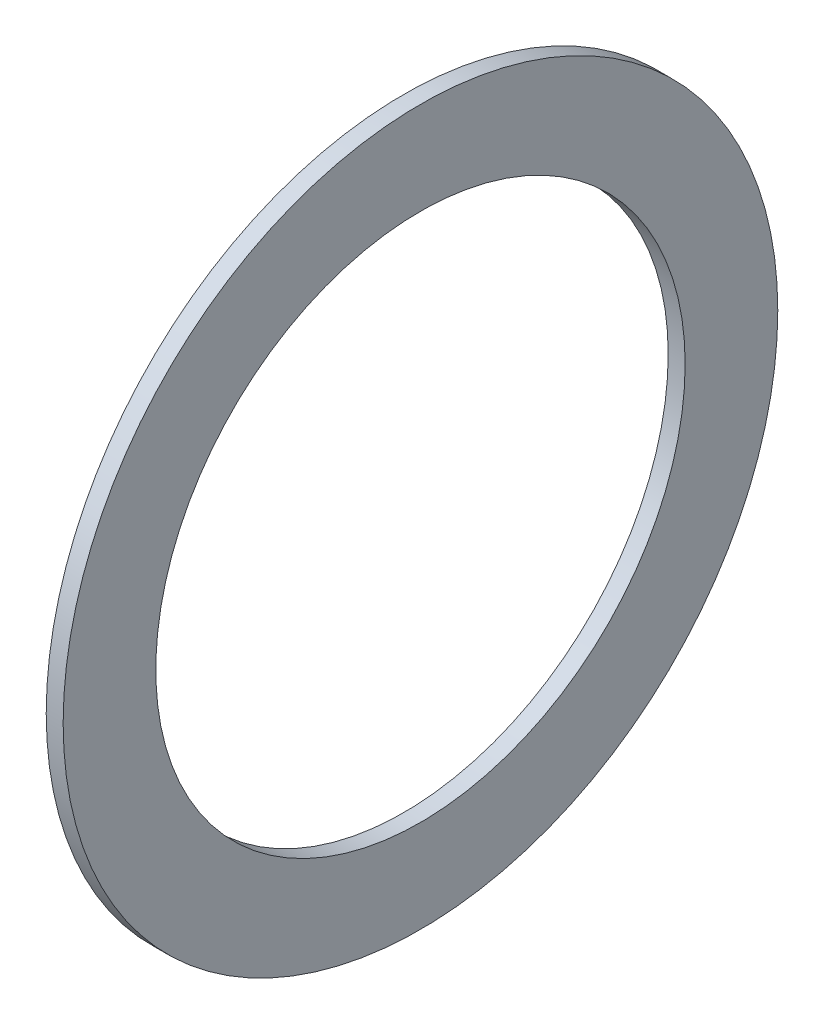
ISO-10303-21;
HEADER;
FILE_DESCRIPTION(('STEP AP214'),'2;1');
FILE_NAME('part.step','',(''),(''),'','','');
FILE_SCHEMA(('AUTOMOTIVE_DESIGN { 1 0 10303 214 1 1 1 1 }'));
ENDSEC;
DATA;
#1=APPLICATION_CONTEXT('core data for automotive mechanical design processes');
#2=APPLICATION_PROTOCOL_DEFINITION('international standard','automotive_design',2000,#1);
#3=PRODUCT_CONTEXT('',#1,'mechanical');
#4=PRODUCT('Part','Part','',(#3));
#5=PRODUCT_RELATED_PRODUCT_CATEGORY('part','',(#4));
#6=PRODUCT_DEFINITION_FORMATION('','',#4);
#7=PRODUCT_DEFINITION_CONTEXT('part definition',#1,'design');
#8=PRODUCT_DEFINITION('design','',#6,#7);
#9=PRODUCT_DEFINITION_SHAPE('','',#8);
#10=(LENGTH_UNIT() NAMED_UNIT(*) SI_UNIT(.MILLI.,.METRE.));
#11=(NAMED_UNIT(*) PLANE_ANGLE_UNIT() SI_UNIT($,.RADIAN.));
#12=(NAMED_UNIT(*) SI_UNIT($,.STERADIAN.) SOLID_ANGLE_UNIT());
#13=UNCERTAINTY_MEASURE_WITH_UNIT(LENGTH_MEASURE(1.E-05),#10,'distance_accuracy_value','');
#14=(GEOMETRIC_REPRESENTATION_CONTEXT(3) GLOBAL_UNCERTAINTY_ASSIGNED_CONTEXT((#13)) GLOBAL_UNIT_ASSIGNED_CONTEXT((#10,
#11,#12)) REPRESENTATION_CONTEXT('',''));
#15=CARTESIAN_POINT('',(0.,0.,0.));
#16=DIRECTION('',(0.,0.,1.));
#17=DIRECTION('',(1.,0.,0.));
#18=AXIS2_PLACEMENT_3D('',#15,#16,#17);
#19=CARTESIAN_POINT('',(1.6,-68.2479295829236,67.5));
#20=DIRECTION('',(1.,0.,0.));
#21=DIRECTION('',(0.,0.,-1.));
#22=AXIS2_PLACEMENT_3D('',#19,#20,#21);
#23=PLANE('',#22);
#24=CARTESIAN_POINT('',(1.6,0.,0.));
#25=DIRECTION('',(1.,0.,0.));
#26=DIRECTION('',(0.,-1.16865058535714E-09,1.));
#27=AXIS2_PLACEMENT_3D('',#24,#25,#26);
#28=CIRCLE('',#27,67.5);
#29=CARTESIAN_POINT('',(1.6,-7.88839145116071E-08,67.5));
#30=VERTEX_POINT('',#29);
#31=EDGE_CURVE('E30',#30,#30,#28,.T.);
#32=ORIENTED_EDGE('',*,*,#31,.T.);
#33=EDGE_LOOP('',(#32));
#34=FACE_BOUND('',#33,.T.);
#35=CARTESIAN_POINT('',(1.6,0.,0.));
#36=DIRECTION('',(-1.,0.,0.));
#37=DIRECTION('',(0.,-1.16851708753529E-09,-1.));
#38=AXIS2_PLACEMENT_3D('',#35,#36,#37);
#39=CIRCLE('',#38,50.);
#40=CARTESIAN_POINT('',(1.6,-5.84258543767646E-08,-50.));
#41=VERTEX_POINT('',#40);
#42=EDGE_CURVE('E26',#41,#41,#39,.F.);
#43=ORIENTED_EDGE('',*,*,#42,.F.);
#44=EDGE_LOOP('',(#43));
#45=FACE_BOUND('',#44,.T.);
#46=ADVANCED_FACE('F15',(#34,#45),#23,.T.);
#47=CARTESIAN_POINT('',(-1.6,-68.2479295829236,67.5));
#48=DIRECTION('',(-1.,0.,0.));
#49=DIRECTION('',(0.,1.,0.));
#50=AXIS2_PLACEMENT_3D('',#47,#48,#49);
#51=PLANE('',#50);
#52=CARTESIAN_POINT('',(-1.6,0.,0.));
#53=DIRECTION('',(-1.,0.,0.));
#54=DIRECTION('',(0.,-1.16865121695069E-09,-1.));
#55=AXIS2_PLACEMENT_3D('',#52,#53,#54);
#56=CIRCLE('',#55,67.5);
#57=CARTESIAN_POINT('',(-1.6,-7.88839571441713E-08,-67.5));
#58=VERTEX_POINT('',#57);
#59=EDGE_CURVE('E22',#58,#58,#56,.F.);
#60=ORIENTED_EDGE('',*,*,#59,.F.);
#61=EDGE_LOOP('',(#60));
#62=FACE_BOUND('',#61,.T.);
#63=CARTESIAN_POINT('',(-1.6,0.,0.));
#64=DIRECTION('',(1.,0.,0.));
#65=DIRECTION('',(0.,-1.16851708753529E-09,1.));
#66=AXIS2_PLACEMENT_3D('',#63,#64,#65);
#67=CIRCLE('',#66,50.);
#68=CARTESIAN_POINT('',(-1.6,-5.84258543767646E-08,50.));
#69=VERTEX_POINT('',#68);
#70=EDGE_CURVE('E10',#69,#69,#67,.T.);
#71=ORIENTED_EDGE('',*,*,#70,.T.);
#72=EDGE_LOOP('',(#71));
#73=FACE_BOUND('',#72,.T.);
#74=ADVANCED_FACE('F44',(#62,#73),#51,.T.);
#75=CARTESIAN_POINT('',(1.6,0.,0.));
#76=DIRECTION('',(-1.,0.,0.));
#77=DIRECTION('',(0.,0.,-1.));
#78=AXIS2_PLACEMENT_3D('',#75,#76,#77);
#79=CYLINDRICAL_SURFACE('',#78,50.);
#80=ORIENTED_EDGE('',*,*,#42,.T.);
#81=EDGE_LOOP('',(#80));
#82=FACE_BOUND('',#81,.T.);
#83=ORIENTED_EDGE('',*,*,#70,.F.);
#84=EDGE_LOOP('',(#83));
#85=FACE_BOUND('',#84,.T.);
#86=ADVANCED_FACE('F39',(#82,#85),#79,.F.);
#87=CARTESIAN_POINT('',(1.6,0.,0.));
#88=DIRECTION('',(-1.,0.,0.));
#89=DIRECTION('',(0.,0.,-1.));
#90=AXIS2_PLACEMENT_3D('',#87,#88,#89);
#91=CYLINDRICAL_SURFACE('',#90,67.5);
#92=ORIENTED_EDGE('',*,*,#31,.F.);
#93=EDGE_LOOP('',(#92));
#94=FACE_BOUND('',#93,.T.);
#95=ORIENTED_EDGE('',*,*,#59,.T.);
#96=EDGE_LOOP('',(#95));
#97=FACE_BOUND('',#96,.T.);
#98=ADVANCED_FACE('F17',(#94,#97),#91,.T.);
#99=CLOSED_SHELL('',(#46,#74,#86,#98));
#100=MANIFOLD_SOLID_BREP('B1',#99);
#101=ADVANCED_BREP_SHAPE_REPRESENTATION('',(#18,#100),#14);
#102=SHAPE_DEFINITION_REPRESENTATION(#9,#101);
ENDSEC;
END-ISO-10303-21;
